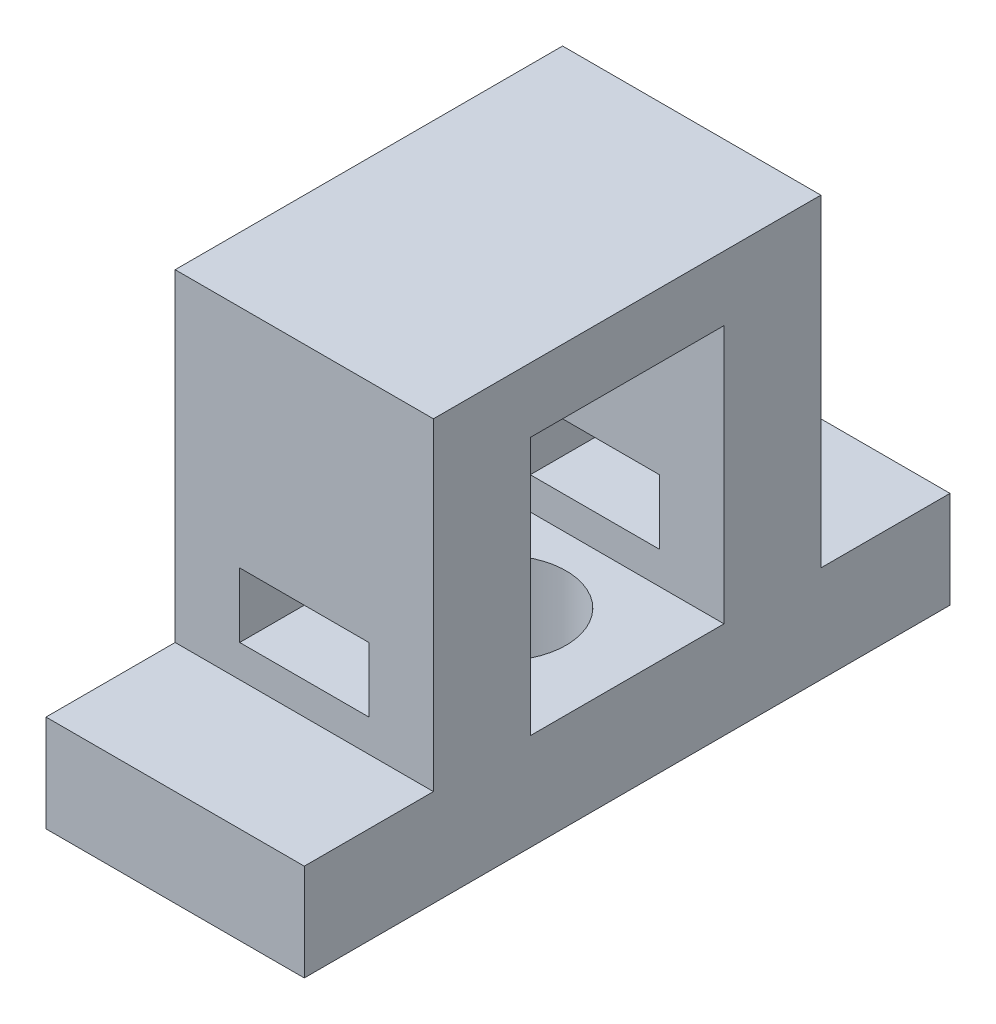
ISO-10303-21;
HEADER;
FILE_DESCRIPTION(('STEP AP214'),'2;1');
FILE_NAME('part.step','',(''),(''),'','','');
FILE_SCHEMA(('AUTOMOTIVE_DESIGN { 1 0 10303 214 1 1 1 1 }'));
ENDSEC;
DATA;
#1=APPLICATION_CONTEXT('core data for automotive mechanical design processes');
#2=APPLICATION_PROTOCOL_DEFINITION('international standard','automotive_design',2000,#1);
#3=PRODUCT_CONTEXT('',#1,'mechanical');
#4=PRODUCT('Part','Part','',(#3));
#5=PRODUCT_RELATED_PRODUCT_CATEGORY('part','',(#4));
#6=PRODUCT_DEFINITION_FORMATION('','',#4);
#7=PRODUCT_DEFINITION_CONTEXT('part definition',#1,'design');
#8=PRODUCT_DEFINITION('design','',#6,#7);
#9=PRODUCT_DEFINITION_SHAPE('','',#8);
#10=(LENGTH_UNIT() NAMED_UNIT(*) SI_UNIT(.MILLI.,.METRE.));
#11=(NAMED_UNIT(*) PLANE_ANGLE_UNIT() SI_UNIT($,.RADIAN.));
#12=(NAMED_UNIT(*) SI_UNIT($,.STERADIAN.) SOLID_ANGLE_UNIT());
#13=UNCERTAINTY_MEASURE_WITH_UNIT(LENGTH_MEASURE(1.E-05),#10,'distance_accuracy_value','');
#14=(GEOMETRIC_REPRESENTATION_CONTEXT(3) GLOBAL_UNCERTAINTY_ASSIGNED_CONTEXT((#13)) GLOBAL_UNIT_ASSIGNED_CONTEXT((#10,
#11,#12)) REPRESENTATION_CONTEXT('',''));
#15=CARTESIAN_POINT('',(0.,0.,0.));
#16=DIRECTION('',(0.,0.,1.));
#17=DIRECTION('',(1.,0.,0.));
#18=AXIS2_PLACEMENT_3D('',#15,#16,#17);
#19=CARTESIAN_POINT('',(40.,0.,0.));
#20=DIRECTION('',(-1.,0.,0.));
#21=DIRECTION('',(0.,0.,1.));
#22=AXIS2_PLACEMENT_3D('',#19,#20,#21);
#23=PLANE('',#22);
#24=DIRECTION('',(0.,0.,-1.));
#25=VECTOR('',#24,1.);
#26=CARTESIAN_POINT('',(40.,-57.0399583229907,-87.9104822589529));
#27=LINE('',#26,#25);
#28=CARTESIAN_POINT('',(40.,-57.0399583229907,12.0895177410471));
#29=VERTEX_POINT('',#28);
#30=CARTESIAN_POINT('',(40.,-57.0399583229907,-87.9104822589529));
#31=VERTEX_POINT('',#30);
#32=EDGE_CURVE('E257',#29,#31,#27,.T.);
#33=ORIENTED_EDGE('',*,*,#32,.T.);
#34=DIRECTION('',(0.,1.,0.));
#35=VECTOR('',#34,1.);
#36=CARTESIAN_POINT('',(40.,-42.0399583229907,-87.9104822589529));
#37=LINE('',#36,#35);
#38=CARTESIAN_POINT('',(40.,-42.0399583229907,-87.9104822589529));
#39=VERTEX_POINT('',#38);
#40=EDGE_CURVE('E260',#31,#39,#37,.T.);
#41=ORIENTED_EDGE('',*,*,#40,.T.);
#42=DIRECTION('',(0.,0.,1.));
#43=VECTOR('',#42,1.);
#44=CARTESIAN_POINT('',(40.,-42.0399583229907,-67.9104822589529));
#45=LINE('',#44,#43);
#46=CARTESIAN_POINT('',(40.,-42.0399583229907,-67.9104822589529));
#47=VERTEX_POINT('',#46);
#48=EDGE_CURVE('E263',#39,#47,#45,.T.);
#49=ORIENTED_EDGE('',*,*,#48,.T.);
#50=DIRECTION('',(0.,1.,0.));
#51=VECTOR('',#50,1.);
#52=CARTESIAN_POINT('',(40.,7.9600416770093,-67.9104822589529));
#53=LINE('',#52,#51);
#54=CARTESIAN_POINT('',(40.,7.9600416770093,-67.9104822589529));
#55=VERTEX_POINT('',#54);
#56=EDGE_CURVE('E265',#47,#55,#53,.T.);
#57=ORIENTED_EDGE('',*,*,#56,.T.);
#58=DIRECTION('',(0.,0.,1.));
#59=VECTOR('',#58,1.);
#60=CARTESIAN_POINT('',(40.,7.9600416770093,-7.91048225895293));
#61=LINE('',#60,#59);
#62=CARTESIAN_POINT('',(40.,7.9600416770093,-7.91048225895293));
#63=VERTEX_POINT('',#62);
#64=EDGE_CURVE('E267',#55,#63,#61,.T.);
#65=ORIENTED_EDGE('',*,*,#64,.T.);
#66=DIRECTION('',(0.,-1.,0.));
#67=VECTOR('',#66,1.);
#68=CARTESIAN_POINT('',(40.,-42.0399583229907,-7.91048225895293));
#69=LINE('',#68,#67);
#70=CARTESIAN_POINT('',(40.,-42.0399583229907,-7.91048225895293));
#71=VERTEX_POINT('',#70);
#72=EDGE_CURVE('E269',#63,#71,#69,.T.);
#73=ORIENTED_EDGE('',*,*,#72,.T.);
#74=DIRECTION('',(0.,0.,1.));
#75=VECTOR('',#74,1.);
#76=CARTESIAN_POINT('',(40.,-42.0399583229907,12.0895177410471));
#77=LINE('',#76,#75);
#78=CARTESIAN_POINT('',(40.,-42.0399583229907,12.0895177410471));
#79=VERTEX_POINT('',#78);
#80=EDGE_CURVE('E271',#71,#79,#77,.T.);
#81=ORIENTED_EDGE('',*,*,#80,.T.);
#82=DIRECTION('',(0.,-1.,0.));
#83=VECTOR('',#82,1.);
#84=CARTESIAN_POINT('',(40.,-57.0399583229907,12.0895177410471));
#85=LINE('',#84,#83);
#86=EDGE_CURVE('E273',#79,#29,#85,.T.);
#87=ORIENTED_EDGE('',*,*,#86,.T.);
#88=EDGE_LOOP('',(#33,#41,#49,#57,#65,#73,#81,#87));
#89=FACE_BOUND('',#88,.T.);
#90=DIRECTION('',(0.,1.,0.));
#91=VECTOR('',#90,1.);
#92=CARTESIAN_POINT('',(40.,-2.03995832299071,-52.9104822589529));
#93=LINE('',#92,#91);
#94=CARTESIAN_POINT('',(40.,-42.0399583229907,-52.9104822589529));
#95=VERTEX_POINT('',#94);
#96=CARTESIAN_POINT('',(40.,-2.03995832299071,-52.9104822589529));
#97=VERTEX_POINT('',#96);
#98=EDGE_CURVE('E226',#95,#97,#93,.T.);
#99=ORIENTED_EDGE('',*,*,#98,.F.);
#100=DIRECTION('',(0.,0.,-1.));
#101=VECTOR('',#100,1.);
#102=CARTESIAN_POINT('',(40.,-42.0399583229907,-22.9104822589529));
#103=LINE('',#102,#101);
#104=CARTESIAN_POINT('',(40.,-42.0399583229907,-22.9104822589529));
#105=VERTEX_POINT('',#104);
#106=EDGE_CURVE('E234',#105,#95,#103,.T.);
#107=ORIENTED_EDGE('',*,*,#106,.F.);
#108=DIRECTION('',(0.,-1.,0.));
#109=VECTOR('',#108,1.);
#110=CARTESIAN_POINT('',(40.,-2.03995832299071,-22.9104822589529));
#111=LINE('',#110,#109);
#112=CARTESIAN_POINT('',(40.,-2.03995832299071,-22.9104822589529));
#113=VERTEX_POINT('',#112);
#114=EDGE_CURVE('E231',#113,#105,#111,.T.);
#115=ORIENTED_EDGE('',*,*,#114,.F.);
#116=DIRECTION('',(0.,0.,1.));
#117=VECTOR('',#116,1.);
#118=CARTESIAN_POINT('',(40.,-2.03995832299071,-22.9104822589529));
#119=LINE('',#118,#117);
#120=EDGE_CURVE('E228',#97,#113,#119,.T.);
#121=ORIENTED_EDGE('',*,*,#120,.F.);
#122=EDGE_LOOP('',(#99,#107,#115,#121));
#123=FACE_BOUND('',#122,.T.);
#124=ADVANCED_FACE('F33',(#89,#123),#23,.F.);
#125=CARTESIAN_POINT('',(0.,0.,0.));
#126=DIRECTION('',(-1.,0.,0.));
#127=DIRECTION('',(0.,0.,1.));
#128=AXIS2_PLACEMENT_3D('',#125,#126,#127);
#129=PLANE('',#128);
#130=DIRECTION('',(0.,0.,-1.));
#131=VECTOR('',#130,1.);
#132=CARTESIAN_POINT('',(0.,-57.0399583229907,-87.9104822589529));
#133=LINE('',#132,#131);
#134=CARTESIAN_POINT('',(0.,-57.0399583229907,12.0895177410471));
#135=VERTEX_POINT('',#134);
#136=CARTESIAN_POINT('',(0.,-57.0399583229907,-87.9104822589529));
#137=VERTEX_POINT('',#136);
#138=EDGE_CURVE('E256',#135,#137,#133,.T.);
#139=ORIENTED_EDGE('',*,*,#138,.F.);
#140=DIRECTION('',(0.,-1.,0.));
#141=VECTOR('',#140,1.);
#142=CARTESIAN_POINT('',(0.,-57.0399583229907,12.0895177410471));
#143=LINE('',#142,#141);
#144=CARTESIAN_POINT('',(0.,-42.0399583229907,12.0895177410471));
#145=VERTEX_POINT('',#144);
#146=EDGE_CURVE('E261',#145,#135,#143,.T.);
#147=ORIENTED_EDGE('',*,*,#146,.F.);
#148=DIRECTION('',(0.,0.,1.));
#149=VECTOR('',#148,1.);
#150=CARTESIAN_POINT('',(0.,-42.0399583229907,12.0895177410471));
#151=LINE('',#150,#149);
#152=CARTESIAN_POINT('',(0.,-42.0399583229907,-7.91048225895293));
#153=VERTEX_POINT('',#152);
#154=EDGE_CURVE('E288',#153,#145,#151,.T.);
#155=ORIENTED_EDGE('',*,*,#154,.F.);
#156=DIRECTION('',(0.,-1.,0.));
#157=VECTOR('',#156,1.);
#158=CARTESIAN_POINT('',(0.,-42.0399583229907,-7.91048225895293));
#159=LINE('',#158,#157);
#160=CARTESIAN_POINT('',(0.,7.9600416770093,-7.91048225895293));
#161=VERTEX_POINT('',#160);
#162=EDGE_CURVE('E286',#161,#153,#159,.T.);
#163=ORIENTED_EDGE('',*,*,#162,.F.);
#164=DIRECTION('',(0.,0.,1.));
#165=VECTOR('',#164,1.);
#166=CARTESIAN_POINT('',(0.,7.9600416770093,-7.91048225895293));
#167=LINE('',#166,#165);
#168=CARTESIAN_POINT('',(0.,7.9600416770093,-67.9104822589529));
#169=VERTEX_POINT('',#168);
#170=EDGE_CURVE('E284',#169,#161,#167,.T.);
#171=ORIENTED_EDGE('',*,*,#170,.F.);
#172=DIRECTION('',(0.,1.,0.));
#173=VECTOR('',#172,1.);
#174=CARTESIAN_POINT('',(0.,7.9600416770093,-67.9104822589529));
#175=LINE('',#174,#173);
#176=CARTESIAN_POINT('',(0.,-42.0399583229907,-67.9104822589529));
#177=VERTEX_POINT('',#176);
#178=EDGE_CURVE('E282',#177,#169,#175,.T.);
#179=ORIENTED_EDGE('',*,*,#178,.F.);
#180=DIRECTION('',(0.,0.,1.));
#181=VECTOR('',#180,1.);
#182=CARTESIAN_POINT('',(0.,-42.0399583229907,-67.9104822589529));
#183=LINE('',#182,#181);
#184=CARTESIAN_POINT('',(0.,-42.0399583229907,-87.9104822589529));
#185=VERTEX_POINT('',#184);
#186=EDGE_CURVE('E280',#185,#177,#183,.T.);
#187=ORIENTED_EDGE('',*,*,#186,.F.);
#188=DIRECTION('',(0.,1.,0.));
#189=VECTOR('',#188,1.);
#190=CARTESIAN_POINT('',(0.,-42.0399583229907,-87.9104822589529));
#191=LINE('',#190,#189);
#192=EDGE_CURVE('E278',#137,#185,#191,.T.);
#193=ORIENTED_EDGE('',*,*,#192,.F.);
#194=EDGE_LOOP('',(#139,#147,#155,#163,#171,#179,#187,#193));
#195=FACE_BOUND('',#194,.T.);
#196=DIRECTION('',(0.,0.,-1.));
#197=VECTOR('',#196,1.);
#198=CARTESIAN_POINT('',(0.,-42.0399583229907,-22.9104822589529));
#199=LINE('',#198,#197);
#200=CARTESIAN_POINT('',(0.,-42.0399583229907,-22.9104822589529));
#201=VERTEX_POINT('',#200);
#202=CARTESIAN_POINT('',(0.,-42.0399583229907,-52.9104822589529));
#203=VERTEX_POINT('',#202);
#204=EDGE_CURVE('E229',#201,#203,#199,.T.);
#205=ORIENTED_EDGE('',*,*,#204,.T.);
#206=DIRECTION('',(0.,1.,0.));
#207=VECTOR('',#206,1.);
#208=CARTESIAN_POINT('',(0.,-2.03995832299071,-52.9104822589529));
#209=LINE('',#208,#207);
#210=CARTESIAN_POINT('',(0.,-2.03995832299071,-52.9104822589529));
#211=VERTEX_POINT('',#210);
#212=EDGE_CURVE('E225',#203,#211,#209,.T.);
#213=ORIENTED_EDGE('',*,*,#212,.T.);
#214=DIRECTION('',(0.,0.,1.));
#215=VECTOR('',#214,1.);
#216=CARTESIAN_POINT('',(0.,-2.03995832299071,-22.9104822589529));
#217=LINE('',#216,#215);
#218=CARTESIAN_POINT('',(0.,-2.03995832299071,-22.9104822589529));
#219=VERTEX_POINT('',#218);
#220=EDGE_CURVE('E239',#211,#219,#217,.T.);
#221=ORIENTED_EDGE('',*,*,#220,.T.);
#222=DIRECTION('',(0.,-1.,0.));
#223=VECTOR('',#222,1.);
#224=CARTESIAN_POINT('',(0.,-2.03995832299071,-22.9104822589529));
#225=LINE('',#224,#223);
#226=EDGE_CURVE('E242',#219,#201,#225,.T.);
#227=ORIENTED_EDGE('',*,*,#226,.T.);
#228=EDGE_LOOP('',(#205,#213,#221,#227));
#229=FACE_BOUND('',#228,.T.);
#230=ADVANCED_FACE('F343',(#195,#229),#129,.T.);
#231=CARTESIAN_POINT('',(40.,-57.0399583229907,-87.9104822589529));
#232=DIRECTION('',(0.,1.,0.));
#233=DIRECTION('',(0.,0.,1.));
#234=AXIS2_PLACEMENT_3D('',#231,#232,#233);
#235=PLANE('',#234);
#236=CARTESIAN_POINT('',(20.652222237084,-57.0399583229907,-37.8017785527721));
#237=DIRECTION('',(0.,1.,0.));
#238=DIRECTION('',(0.,0.,1.));
#239=AXIS2_PLACEMENT_3D('',#236,#237,#238);
#240=CIRCLE('',#239,10.);
#241=CARTESIAN_POINT('',(20.652222237084,-57.0399583229907,-27.8017785527721));
#242=VERTEX_POINT('',#241);
#243=EDGE_CURVE('E325',#242,#242,#240,.T.);
#244=ORIENTED_EDGE('',*,*,#243,.T.);
#245=EDGE_LOOP('',(#244));
#246=FACE_BOUND('',#245,.T.);
#247=ORIENTED_EDGE('',*,*,#138,.T.);
#248=DIRECTION('',(-1.,0.,0.));
#249=VECTOR('',#248,1.);
#250=CARTESIAN_POINT('',(40.,-57.0399583229907,-87.9104822589529));
#251=LINE('',#250,#249);
#252=EDGE_CURVE('E311',#31,#137,#251,.T.);
#253=ORIENTED_EDGE('',*,*,#252,.F.);
#254=ORIENTED_EDGE('',*,*,#32,.F.);
#255=DIRECTION('',(-1.,0.,0.));
#256=VECTOR('',#255,1.);
#257=CARTESIAN_POINT('',(40.,-57.0399583229907,12.0895177410471));
#258=LINE('',#257,#256);
#259=EDGE_CURVE('E275',#29,#135,#258,.T.);
#260=ORIENTED_EDGE('',*,*,#259,.T.);
#261=EDGE_LOOP('',(#247,#253,#254,#260));
#262=FACE_BOUND('',#261,.T.);
#263=ADVANCED_FACE('F35',(#246,#262),#235,.F.);
#264=CARTESIAN_POINT('',(40.,-42.0399583229907,-87.9104822589529));
#265=DIRECTION('',(0.,0.,1.));
#266=DIRECTION('',(1.,0.,0.));
#267=AXIS2_PLACEMENT_3D('',#264,#265,#266);
#268=PLANE('',#267);
#269=ORIENTED_EDGE('',*,*,#192,.T.);
#270=DIRECTION('',(-1.,0.,0.));
#271=VECTOR('',#270,1.);
#272=CARTESIAN_POINT('',(40.,-42.0399583229907,-87.9104822589529));
#273=LINE('',#272,#271);
#274=EDGE_CURVE('E308',#39,#185,#273,.T.);
#275=ORIENTED_EDGE('',*,*,#274,.F.);
#276=ORIENTED_EDGE('',*,*,#40,.F.);
#277=ORIENTED_EDGE('',*,*,#252,.T.);
#278=EDGE_LOOP('',(#269,#275,#276,#277));
#279=FACE_BOUND('',#278,.T.);
#280=ADVANCED_FACE('F393',(#279),#268,.F.);
#281=CARTESIAN_POINT('',(40.,-42.0399583229907,-67.9104822589529));
#282=DIRECTION('',(0.,-1.,0.));
#283=DIRECTION('',(0.,0.,-1.));
#284=AXIS2_PLACEMENT_3D('',#281,#282,#283);
#285=PLANE('',#284);
#286=ORIENTED_EDGE('',*,*,#186,.T.);
#287=DIRECTION('',(-1.,0.,0.));
#288=VECTOR('',#287,1.);
#289=CARTESIAN_POINT('',(40.,-42.0399583229907,-67.9104822589529));
#290=LINE('',#289,#288);
#291=EDGE_CURVE('E305',#47,#177,#290,.T.);
#292=ORIENTED_EDGE('',*,*,#291,.F.);
#293=ORIENTED_EDGE('',*,*,#48,.F.);
#294=ORIENTED_EDGE('',*,*,#274,.T.);
#295=EDGE_LOOP('',(#286,#292,#293,#294));
#296=FACE_BOUND('',#295,.T.);
#297=ADVANCED_FACE('F390',(#296),#285,.F.);
#298=CARTESIAN_POINT('',(40.,7.9600416770093,-67.9104822589529));
#299=DIRECTION('',(0.,0.,1.));
#300=DIRECTION('',(1.,0.,0.));
#301=AXIS2_PLACEMENT_3D('',#298,#299,#300);
#302=PLANE('',#301);
#303=DIRECTION('',(1.,0.,0.));
#304=VECTOR('',#303,1.);
#305=CARTESIAN_POINT('',(40.,-37.0399583229907,-67.9104822589529));
#306=LINE('',#305,#304);
#307=CARTESIAN_POINT('',(10.,-37.0399583229907,-67.9104822589529));
#308=VERTEX_POINT('',#307);
#309=CARTESIAN_POINT('',(30.,-37.0399583229907,-67.9104822589529));
#310=VERTEX_POINT('',#309);
#311=EDGE_CURVE('E216',#308,#310,#306,.T.);
#312=ORIENTED_EDGE('',*,*,#311,.T.);
#313=DIRECTION('',(0.,1.,0.));
#314=VECTOR('',#313,1.);
#315=CARTESIAN_POINT('',(30.,7.9600416770093,-67.9104822589529));
#316=LINE('',#315,#314);
#317=CARTESIAN_POINT('',(30.,-27.0399583229907,-67.9104822589529));
#318=VERTEX_POINT('',#317);
#319=EDGE_CURVE('E222',#310,#318,#316,.T.);
#320=ORIENTED_EDGE('',*,*,#319,.T.);
#321=DIRECTION('',(-1.,0.,0.));
#322=VECTOR('',#321,1.);
#323=CARTESIAN_POINT('',(40.,-27.0399583229907,-67.9104822589529));
#324=LINE('',#323,#322);
#325=CARTESIAN_POINT('',(10.,-27.0399583229907,-67.9104822589529));
#326=VERTEX_POINT('',#325);
#327=EDGE_CURVE('E206',#318,#326,#324,.T.);
#328=ORIENTED_EDGE('',*,*,#327,.T.);
#329=DIRECTION('',(0.,-1.,0.));
#330=VECTOR('',#329,1.);
#331=CARTESIAN_POINT('',(10.,7.9600416770093,-67.9104822589529));
#332=LINE('',#331,#330);
#333=EDGE_CURVE('E211',#326,#308,#332,.T.);
#334=ORIENTED_EDGE('',*,*,#333,.T.);
#335=EDGE_LOOP('',(#312,#320,#328,#334));
#336=FACE_BOUND('',#335,.T.);
#337=ORIENTED_EDGE('',*,*,#178,.T.);
#338=DIRECTION('',(-1.,0.,0.));
#339=VECTOR('',#338,1.);
#340=CARTESIAN_POINT('',(40.,7.9600416770093,-67.9104822589529));
#341=LINE('',#340,#339);
#342=EDGE_CURVE('E302',#55,#169,#341,.T.);
#343=ORIENTED_EDGE('',*,*,#342,.F.);
#344=ORIENTED_EDGE('',*,*,#56,.F.);
#345=ORIENTED_EDGE('',*,*,#291,.T.);
#346=EDGE_LOOP('',(#337,#343,#344,#345));
#347=FACE_BOUND('',#346,.T.);
#348=ADVANCED_FACE('F386',(#336,#347),#302,.F.);
#349=CARTESIAN_POINT('',(40.,7.9600416770093,-7.91048225895293));
#350=DIRECTION('',(0.,-1.,0.));
#351=DIRECTION('',(0.,0.,-1.));
#352=AXIS2_PLACEMENT_3D('',#349,#350,#351);
#353=PLANE('',#352);
#354=ORIENTED_EDGE('',*,*,#170,.T.);
#355=DIRECTION('',(-1.,0.,0.));
#356=VECTOR('',#355,1.);
#357=CARTESIAN_POINT('',(40.,7.9600416770093,-7.91048225895293));
#358=LINE('',#357,#356);
#359=EDGE_CURVE('E299',#63,#161,#358,.T.);
#360=ORIENTED_EDGE('',*,*,#359,.F.);
#361=ORIENTED_EDGE('',*,*,#64,.F.);
#362=ORIENTED_EDGE('',*,*,#342,.T.);
#363=EDGE_LOOP('',(#354,#360,#361,#362));
#364=FACE_BOUND('',#363,.T.);
#365=ADVANCED_FACE('F383',(#364),#353,.F.);
#366=CARTESIAN_POINT('',(40.,-42.0399583229907,-7.91048225895293));
#367=DIRECTION('',(0.,0.,-1.));
#368=DIRECTION('',(-1.,0.,0.));
#369=AXIS2_PLACEMENT_3D('',#366,#367,#368);
#370=PLANE('',#369);
#371=DIRECTION('',(-1.,0.,0.));
#372=VECTOR('',#371,1.);
#373=CARTESIAN_POINT('',(10.,-27.0399583229907,-7.91048225895293));
#374=LINE('',#373,#372);
#375=CARTESIAN_POINT('',(30.,-27.0399583229907,-7.91048225895293));
#376=VERTEX_POINT('',#375);
#377=CARTESIAN_POINT('',(10.,-27.0399583229907,-7.91048225895293));
#378=VERTEX_POINT('',#377);
#379=EDGE_CURVE('E184',#376,#378,#374,.T.);
#380=ORIENTED_EDGE('',*,*,#379,.F.);
#381=DIRECTION('',(0.,1.,0.));
#382=VECTOR('',#381,1.);
#383=CARTESIAN_POINT('',(30.,-37.0399583229907,-7.91048225895293));
#384=LINE('',#383,#382);
#385=CARTESIAN_POINT('',(30.,-37.0399583229907,-7.91048225895293));
#386=VERTEX_POINT('',#385);
#387=EDGE_CURVE('E56',#386,#376,#384,.T.);
#388=ORIENTED_EDGE('',*,*,#387,.F.);
#389=DIRECTION('',(1.,0.,0.));
#390=VECTOR('',#389,1.);
#391=CARTESIAN_POINT('',(10.,-37.0399583229907,-7.91048225895293));
#392=LINE('',#391,#390);
#393=CARTESIAN_POINT('',(10.,-37.0399583229907,-7.91048225895293));
#394=VERTEX_POINT('',#393);
#395=EDGE_CURVE('E192',#394,#386,#392,.T.);
#396=ORIENTED_EDGE('',*,*,#395,.F.);
#397=DIRECTION('',(0.,-1.,0.));
#398=VECTOR('',#397,1.);
#399=CARTESIAN_POINT('',(10.,-37.0399583229907,-7.91048225895293));
#400=LINE('',#399,#398);
#401=EDGE_CURVE('E175',#378,#394,#400,.T.);
#402=ORIENTED_EDGE('',*,*,#401,.F.);
#403=EDGE_LOOP('',(#380,#388,#396,#402));
#404=FACE_BOUND('',#403,.T.);
#405=ORIENTED_EDGE('',*,*,#162,.T.);
#406=DIRECTION('',(-1.,0.,0.));
#407=VECTOR('',#406,1.);
#408=CARTESIAN_POINT('',(40.,-42.0399583229907,-7.91048225895293));
#409=LINE('',#408,#407);
#410=EDGE_CURVE('E296',#71,#153,#409,.T.);
#411=ORIENTED_EDGE('',*,*,#410,.F.);
#412=ORIENTED_EDGE('',*,*,#72,.F.);
#413=ORIENTED_EDGE('',*,*,#359,.T.);
#414=EDGE_LOOP('',(#405,#411,#412,#413));
#415=FACE_BOUND('',#414,.T.);
#416=ADVANCED_FACE('F189',(#404,#415),#370,.F.);
#417=CARTESIAN_POINT('',(40.,-42.0399583229907,12.0895177410471));
#418=DIRECTION('',(0.,-1.,0.));
#419=DIRECTION('',(0.,0.,-1.));
#420=AXIS2_PLACEMENT_3D('',#417,#418,#419);
#421=PLANE('',#420);
#422=ORIENTED_EDGE('',*,*,#154,.T.);
#423=DIRECTION('',(-1.,0.,0.));
#424=VECTOR('',#423,1.);
#425=CARTESIAN_POINT('',(40.,-42.0399583229907,12.0895177410471));
#426=LINE('',#425,#424);
#427=EDGE_CURVE('E293',#79,#145,#426,.T.);
#428=ORIENTED_EDGE('',*,*,#427,.F.);
#429=ORIENTED_EDGE('',*,*,#80,.F.);
#430=ORIENTED_EDGE('',*,*,#410,.T.);
#431=EDGE_LOOP('',(#422,#428,#429,#430));
#432=FACE_BOUND('',#431,.T.);
#433=ADVANCED_FACE('F376',(#432),#421,.F.);
#434=CARTESIAN_POINT('',(40.,-57.0399583229907,12.0895177410471));
#435=DIRECTION('',(0.,0.,-1.));
#436=DIRECTION('',(-1.,0.,0.));
#437=AXIS2_PLACEMENT_3D('',#434,#435,#436);
#438=PLANE('',#437);
#439=ORIENTED_EDGE('',*,*,#146,.T.);
#440=ORIENTED_EDGE('',*,*,#259,.F.);
#441=ORIENTED_EDGE('',*,*,#86,.F.);
#442=ORIENTED_EDGE('',*,*,#427,.T.);
#443=EDGE_LOOP('',(#439,#440,#441,#442));
#444=FACE_BOUND('',#443,.T.);
#445=ADVANCED_FACE('F362',(#444),#438,.F.);
#446=CARTESIAN_POINT('',(40.,-2.03995832299071,-52.9104822589529));
#447=DIRECTION('',(0.,0.,1.));
#448=DIRECTION('',(1.,0.,0.));
#449=AXIS2_PLACEMENT_3D('',#446,#447,#448);
#450=PLANE('',#449);
#451=DIRECTION('',(0.,1.,0.));
#452=VECTOR('',#451,1.);
#453=CARTESIAN_POINT('',(30.,-2.03995832299071,-52.9104822589529));
#454=LINE('',#453,#452);
#455=CARTESIAN_POINT('',(30.,-37.0399583229907,-52.9104822589529));
#456=VERTEX_POINT('',#455);
#457=CARTESIAN_POINT('',(30.,-27.0399583229907,-52.9104822589529));
#458=VERTEX_POINT('',#457);
#459=EDGE_CURVE('E219',#456,#458,#454,.T.);
#460=ORIENTED_EDGE('',*,*,#459,.F.);
#461=DIRECTION('',(1.,0.,0.));
#462=VECTOR('',#461,1.);
#463=CARTESIAN_POINT('',(40.,-37.0399583229907,-52.9104822589529));
#464=LINE('',#463,#462);
#465=CARTESIAN_POINT('',(10.,-37.0399583229907,-52.9104822589529));
#466=VERTEX_POINT('',#465);
#467=EDGE_CURVE('E214',#466,#456,#464,.T.);
#468=ORIENTED_EDGE('',*,*,#467,.F.);
#469=DIRECTION('',(0.,-1.,0.));
#470=VECTOR('',#469,1.);
#471=CARTESIAN_POINT('',(10.,-2.03995832299071,-52.9104822589529));
#472=LINE('',#471,#470);
#473=CARTESIAN_POINT('',(10.,-27.0399583229907,-52.9104822589529));
#474=VERTEX_POINT('',#473);
#475=EDGE_CURVE('E209',#474,#466,#472,.T.);
#476=ORIENTED_EDGE('',*,*,#475,.F.);
#477=DIRECTION('',(-1.,0.,0.));
#478=VECTOR('',#477,1.);
#479=CARTESIAN_POINT('',(40.,-27.0399583229907,-52.9104822589529));
#480=LINE('',#479,#478);
#481=EDGE_CURVE('E204',#458,#474,#480,.T.);
#482=ORIENTED_EDGE('',*,*,#481,.F.);
#483=EDGE_LOOP('',(#460,#468,#476,#482));
#484=FACE_BOUND('',#483,.T.);
#485=ORIENTED_EDGE('',*,*,#212,.F.);
#486=DIRECTION('',(-1.,0.,0.));
#487=VECTOR('',#486,1.);
#488=CARTESIAN_POINT('',(40.,-42.0399583229907,-52.9104822589529));
#489=LINE('',#488,#487);
#490=EDGE_CURVE('E236',#95,#203,#489,.T.);
#491=ORIENTED_EDGE('',*,*,#490,.F.);
#492=ORIENTED_EDGE('',*,*,#98,.T.);
#493=DIRECTION('',(-1.,0.,0.));
#494=VECTOR('',#493,1.);
#495=CARTESIAN_POINT('',(40.,-2.03995832299071,-52.9104822589529));
#496=LINE('',#495,#494);
#497=EDGE_CURVE('E253',#97,#211,#496,.T.);
#498=ORIENTED_EDGE('',*,*,#497,.T.);
#499=EDGE_LOOP('',(#485,#491,#492,#498));
#500=FACE_BOUND('',#499,.T.);
#501=ADVANCED_FACE('F351',(#484,#500),#450,.T.);
#502=CARTESIAN_POINT('',(40.,-2.03995832299071,-22.9104822589529));
#503=DIRECTION('',(0.,-1.,0.));
#504=DIRECTION('',(0.,0.,-1.));
#505=AXIS2_PLACEMENT_3D('',#502,#503,#504);
#506=PLANE('',#505);
#507=ORIENTED_EDGE('',*,*,#220,.F.);
#508=ORIENTED_EDGE('',*,*,#497,.F.);
#509=ORIENTED_EDGE('',*,*,#120,.T.);
#510=DIRECTION('',(-1.,0.,0.));
#511=VECTOR('',#510,1.);
#512=CARTESIAN_POINT('',(40.,-2.03995832299071,-22.9104822589529));
#513=LINE('',#512,#511);
#514=EDGE_CURVE('E251',#113,#219,#513,.T.);
#515=ORIENTED_EDGE('',*,*,#514,.T.);
#516=EDGE_LOOP('',(#507,#508,#509,#515));
#517=FACE_BOUND('',#516,.T.);
#518=ADVANCED_FACE('F354',(#517),#506,.T.);
#519=CARTESIAN_POINT('',(40.,-2.03995832299071,-22.9104822589529));
#520=DIRECTION('',(0.,0.,-1.));
#521=DIRECTION('',(0.,1.,0.));
#522=AXIS2_PLACEMENT_3D('',#519,#520,#521);
#523=PLANE('',#522);
#524=DIRECTION('',(0.,-1.,0.));
#525=VECTOR('',#524,1.);
#526=CARTESIAN_POINT('',(30.,-2.03995832299071,-22.9104822589529));
#527=LINE('',#526,#525);
#528=CARTESIAN_POINT('',(30.,-27.0399583229907,-22.9104822589529));
#529=VERTEX_POINT('',#528);
#530=CARTESIAN_POINT('',(30.,-37.0399583229907,-22.9104822589529));
#531=VERTEX_POINT('',#530);
#532=EDGE_CURVE('E11',#529,#531,#527,.T.);
#533=ORIENTED_EDGE('',*,*,#532,.F.);
#534=DIRECTION('',(1.,0.,0.));
#535=VECTOR('',#534,1.);
#536=CARTESIAN_POINT('',(40.,-27.0399583229907,-22.9104822589529));
#537=LINE('',#536,#535);
#538=CARTESIAN_POINT('',(10.,-27.0399583229907,-22.9104822589529));
#539=VERTEX_POINT('',#538);
#540=EDGE_CURVE('E314',#539,#529,#537,.T.);
#541=ORIENTED_EDGE('',*,*,#540,.F.);
#542=DIRECTION('',(0.,1.,0.));
#543=VECTOR('',#542,1.);
#544=CARTESIAN_POINT('',(10.,-2.03995832299071,-22.9104822589529));
#545=LINE('',#544,#543);
#546=CARTESIAN_POINT('',(10.,-37.0399583229907,-22.9104822589529));
#547=VERTEX_POINT('',#546);
#548=EDGE_CURVE('E178',#547,#539,#545,.T.);
#549=ORIENTED_EDGE('',*,*,#548,.F.);
#550=DIRECTION('',(-1.,0.,0.));
#551=VECTOR('',#550,1.);
#552=CARTESIAN_POINT('',(40.,-37.0399583229907,-22.9104822589529));
#553=LINE('',#552,#551);
#554=EDGE_CURVE('E41',#531,#547,#553,.T.);
#555=ORIENTED_EDGE('',*,*,#554,.F.);
#556=EDGE_LOOP('',(#533,#541,#549,#555));
#557=FACE_BOUND('',#556,.T.);
#558=ORIENTED_EDGE('',*,*,#226,.F.);
#559=ORIENTED_EDGE('',*,*,#514,.F.);
#560=ORIENTED_EDGE('',*,*,#114,.T.);
#561=DIRECTION('',(-1.,0.,0.));
#562=VECTOR('',#561,1.);
#563=CARTESIAN_POINT('',(40.,-42.0399583229907,-22.9104822589529));
#564=LINE('',#563,#562);
#565=EDGE_CURVE('E249',#105,#201,#564,.T.);
#566=ORIENTED_EDGE('',*,*,#565,.T.);
#567=EDGE_LOOP('',(#558,#559,#560,#566));
#568=FACE_BOUND('',#567,.T.);
#569=ADVANCED_FACE('F322',(#557,#568),#523,.T.);
#570=CARTESIAN_POINT('',(40.,-42.0399583229907,-22.9104822589529));
#571=DIRECTION('',(0.,1.,0.));
#572=DIRECTION('',(0.,0.,1.));
#573=AXIS2_PLACEMENT_3D('',#570,#571,#572);
#574=PLANE('',#573);
#575=CARTESIAN_POINT('',(20.652222237084,-42.0399583229907,-37.8017785527721));
#576=DIRECTION('',(0.,1.,0.));
#577=DIRECTION('',(0.,0.,1.));
#578=AXIS2_PLACEMENT_3D('',#575,#576,#577);
#579=CIRCLE('',#578,10.);
#580=CARTESIAN_POINT('',(20.652222237084,-42.0399583229907,-27.8017785527721));
#581=VERTEX_POINT('',#580);
#582=EDGE_CURVE('E327',#581,#581,#579,.T.);
#583=ORIENTED_EDGE('',*,*,#582,.F.);
#584=EDGE_LOOP('',(#583));
#585=FACE_BOUND('',#584,.T.);
#586=ORIENTED_EDGE('',*,*,#204,.F.);
#587=ORIENTED_EDGE('',*,*,#565,.F.);
#588=ORIENTED_EDGE('',*,*,#106,.T.);
#589=ORIENTED_EDGE('',*,*,#490,.T.);
#590=EDGE_LOOP('',(#586,#587,#588,#589));
#591=FACE_BOUND('',#590,.T.);
#592=ADVANCED_FACE('F335',(#585,#591),#574,.T.);
#593=CARTESIAN_POINT('',(10.,-27.0399583229907,-87.9104822589529));
#594=DIRECTION('',(0.,1.,0.));
#595=DIRECTION('',(0.,0.,1.));
#596=AXIS2_PLACEMENT_3D('',#593,#594,#595);
#597=PLANE('',#596);
#598=ORIENTED_EDGE('',*,*,#540,.T.);
#599=DIRECTION('',(0.,0.,1.));
#600=VECTOR('',#599,1.);
#601=CARTESIAN_POINT('',(30.,-27.0399583229907,-87.9104822589529));
#602=LINE('',#601,#600);
#603=EDGE_CURVE('E186',#529,#376,#602,.T.);
#604=ORIENTED_EDGE('',*,*,#603,.T.);
#605=ORIENTED_EDGE('',*,*,#379,.T.);
#606=DIRECTION('',(0.,0.,1.));
#607=VECTOR('',#606,1.);
#608=CARTESIAN_POINT('',(10.,-27.0399583229907,-87.9104822589529));
#609=LINE('',#608,#607);
#610=EDGE_CURVE('E170',#539,#378,#609,.T.);
#611=ORIENTED_EDGE('',*,*,#610,.F.);
#612=EDGE_LOOP('',(#598,#604,#605,#611));
#613=FACE_BOUND('',#612,.T.);
#614=ADVANCED_FACE('F185',(#613),#597,.F.);
#615=CARTESIAN_POINT('',(10.,-37.0399583229907,-87.9104822589529));
#616=DIRECTION('',(-1.,0.,0.));
#617=DIRECTION('',(0.,0.,1.));
#618=AXIS2_PLACEMENT_3D('',#615,#616,#617);
#619=PLANE('',#618);
#620=ORIENTED_EDGE('',*,*,#548,.T.);
#621=ORIENTED_EDGE('',*,*,#610,.T.);
#622=ORIENTED_EDGE('',*,*,#401,.T.);
#623=DIRECTION('',(0.,0.,1.));
#624=VECTOR('',#623,1.);
#625=CARTESIAN_POINT('',(10.,-37.0399583229907,-87.9104822589529));
#626=LINE('',#625,#624);
#627=EDGE_CURVE('E201',#547,#394,#626,.T.);
#628=ORIENTED_EDGE('',*,*,#627,.F.);
#629=EDGE_LOOP('',(#620,#621,#622,#628));
#630=FACE_BOUND('',#629,.T.);
#631=ADVANCED_FACE('F172',(#630),#619,.F.);
#632=CARTESIAN_POINT('',(10.,-37.0399583229907,-87.9104822589529));
#633=DIRECTION('',(0.,-1.,0.));
#634=DIRECTION('',(0.,0.,-1.));
#635=AXIS2_PLACEMENT_3D('',#632,#633,#634);
#636=PLANE('',#635);
#637=ORIENTED_EDGE('',*,*,#554,.T.);
#638=ORIENTED_EDGE('',*,*,#627,.T.);
#639=ORIENTED_EDGE('',*,*,#395,.T.);
#640=DIRECTION('',(0.,0.,1.));
#641=VECTOR('',#640,1.);
#642=CARTESIAN_POINT('',(30.,-37.0399583229907,-87.9104822589529));
#643=LINE('',#642,#641);
#644=EDGE_CURVE('E197',#531,#386,#643,.T.);
#645=ORIENTED_EDGE('',*,*,#644,.F.);
#646=EDGE_LOOP('',(#637,#638,#639,#645));
#647=FACE_BOUND('',#646,.T.);
#648=ADVANCED_FACE('F319',(#647),#636,.F.);
#649=CARTESIAN_POINT('',(30.,-37.0399583229907,-87.9104822589529));
#650=DIRECTION('',(1.,0.,0.));
#651=DIRECTION('',(0.,0.,-1.));
#652=AXIS2_PLACEMENT_3D('',#649,#650,#651);
#653=PLANE('',#652);
#654=ORIENTED_EDGE('',*,*,#532,.T.);
#655=ORIENTED_EDGE('',*,*,#644,.T.);
#656=ORIENTED_EDGE('',*,*,#387,.T.);
#657=ORIENTED_EDGE('',*,*,#603,.F.);
#658=EDGE_LOOP('',(#654,#655,#656,#657));
#659=FACE_BOUND('',#658,.T.);
#660=ADVANCED_FACE('F324',(#659),#653,.F.);
#661=EDGE_CURVE('E199',#310,#456,#643,.T.);
#662=ORIENTED_EDGE('',*,*,#661,.T.);
#663=ORIENTED_EDGE('',*,*,#459,.T.);
#664=EDGE_CURVE('E181',#318,#458,#602,.T.);
#665=ORIENTED_EDGE('',*,*,#664,.F.);
#666=ORIENTED_EDGE('',*,*,#319,.F.);
#667=EDGE_LOOP('',(#662,#663,#665,#666));
#668=FACE_BOUND('',#667,.T.);
#669=ADVANCED_FACE('F445',(#668),#653,.F.);
#670=EDGE_CURVE('E200',#308,#466,#626,.T.);
#671=ORIENTED_EDGE('',*,*,#670,.T.);
#672=ORIENTED_EDGE('',*,*,#467,.T.);
#673=ORIENTED_EDGE('',*,*,#661,.F.);
#674=ORIENTED_EDGE('',*,*,#311,.F.);
#675=EDGE_LOOP('',(#671,#672,#673,#674));
#676=FACE_BOUND('',#675,.T.);
#677=ADVANCED_FACE('F440',(#676),#636,.F.);
#678=EDGE_CURVE('E48',#326,#474,#609,.T.);
#679=ORIENTED_EDGE('',*,*,#678,.T.);
#680=ORIENTED_EDGE('',*,*,#475,.T.);
#681=ORIENTED_EDGE('',*,*,#670,.F.);
#682=ORIENTED_EDGE('',*,*,#333,.F.);
#683=EDGE_LOOP('',(#679,#680,#681,#682));
#684=FACE_BOUND('',#683,.T.);
#685=ADVANCED_FACE('F435',(#684),#619,.F.);
#686=ORIENTED_EDGE('',*,*,#664,.T.);
#687=ORIENTED_EDGE('',*,*,#481,.T.);
#688=ORIENTED_EDGE('',*,*,#678,.F.);
#689=ORIENTED_EDGE('',*,*,#327,.F.);
#690=EDGE_LOOP('',(#686,#687,#688,#689));
#691=FACE_BOUND('',#690,.T.);
#692=ADVANCED_FACE('F430',(#691),#597,.F.);
#693=CARTESIAN_POINT('',(20.652222237084,-57.0399583229907,-37.8017785527721));
#694=DIRECTION('',(0.,1.,0.));
#695=DIRECTION('',(0.,0.,1.));
#696=AXIS2_PLACEMENT_3D('',#693,#694,#695);
#697=CYLINDRICAL_SURFACE('',#696,10.);
#698=ORIENTED_EDGE('',*,*,#243,.F.);
#699=EDGE_LOOP('',(#698));
#700=FACE_BOUND('',#699,.T.);
#701=ORIENTED_EDGE('',*,*,#582,.T.);
#702=EDGE_LOOP('',(#701));
#703=FACE_BOUND('',#702,.T.);
#704=ADVANCED_FACE('F333',(#700,#703),#697,.F.);
#705=CLOSED_SHELL('',(#124,#230,#263,#280,#297,#348,#365,#416,#433,#445,#501,#518,#569,#592,
#614,#631,#648,#660,#669,#677,#685,#692,#704));
#706=MANIFOLD_SOLID_BREP('B2',#705);
#707=ADVANCED_BREP_SHAPE_REPRESENTATION('',(#18,#706),#14);
#708=SHAPE_DEFINITION_REPRESENTATION(#9,#707);
ENDSEC;
END-ISO-10303-21;
